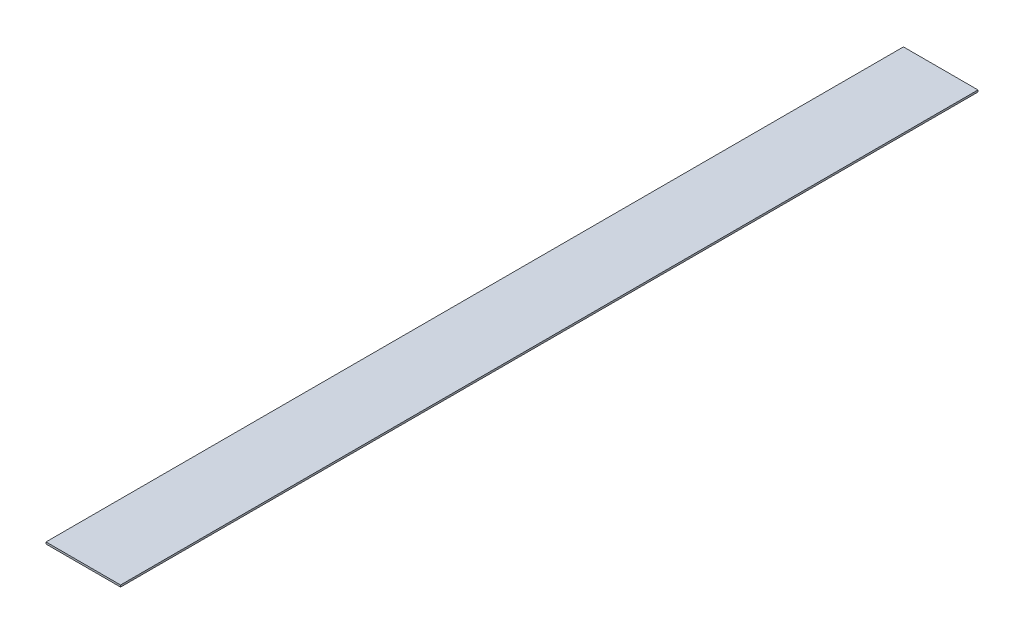
ISO-10303-21;
HEADER;
FILE_DESCRIPTION(('STEP AP214'),'2;1');
FILE_NAME('part.step','',(''),(''),'','','');
FILE_SCHEMA(('AUTOMOTIVE_DESIGN { 1 0 10303 214 1 1 1 1 }'));
ENDSEC;
DATA;
#1=APPLICATION_CONTEXT('core data for automotive mechanical design processes');
#2=APPLICATION_PROTOCOL_DEFINITION('international standard','automotive_design',2000,#1);
#3=PRODUCT_CONTEXT('',#1,'mechanical');
#4=PRODUCT('Part','Part','',(#3));
#5=PRODUCT_RELATED_PRODUCT_CATEGORY('part','',(#4));
#6=PRODUCT_DEFINITION_FORMATION('','',#4);
#7=PRODUCT_DEFINITION_CONTEXT('part definition',#1,'design');
#8=PRODUCT_DEFINITION('design','',#6,#7);
#9=PRODUCT_DEFINITION_SHAPE('','',#8);
#10=(LENGTH_UNIT() NAMED_UNIT(*) SI_UNIT(.MILLI.,.METRE.));
#11=(NAMED_UNIT(*) PLANE_ANGLE_UNIT() SI_UNIT($,.RADIAN.));
#12=(NAMED_UNIT(*) SI_UNIT($,.STERADIAN.) SOLID_ANGLE_UNIT());
#13=UNCERTAINTY_MEASURE_WITH_UNIT(LENGTH_MEASURE(1.E-05),#10,'distance_accuracy_value','');
#14=(GEOMETRIC_REPRESENTATION_CONTEXT(3) GLOBAL_UNCERTAINTY_ASSIGNED_CONTEXT((#13)) GLOBAL_UNIT_ASSIGNED_CONTEXT((#10,
#11,#12)) REPRESENTATION_CONTEXT('',''));
#15=CARTESIAN_POINT('',(0.,0.,0.));
#16=DIRECTION('',(0.,0.,1.));
#17=DIRECTION('',(1.,0.,0.));
#18=AXIS2_PLACEMENT_3D('',#15,#16,#17);
#19=CARTESIAN_POINT('',(100.,2.5,1150.));
#20=DIRECTION('',(-1.,0.,0.));
#21=DIRECTION('',(0.,0.,1.));
#22=AXIS2_PLACEMENT_3D('',#19,#20,#21);
#23=PLANE('',#22);
#24=DIRECTION('',(0.,1.,0.));
#25=VECTOR('',#24,1.);
#26=CARTESIAN_POINT('',(100.,2.5,-1150.));
#27=LINE('',#26,#25);
#28=CARTESIAN_POINT('',(100.,-2.5,-1150.));
#29=VERTEX_POINT('',#28);
#30=CARTESIAN_POINT('',(100.,2.5,-1150.));
#31=VERTEX_POINT('',#30);
#32=EDGE_CURVE('E95',#29,#31,#27,.T.);
#33=ORIENTED_EDGE('',*,*,#32,.T.);
#34=DIRECTION('',(0.,0.,-1.));
#35=VECTOR('',#34,1.);
#36=CARTESIAN_POINT('',(100.,2.5,1150.));
#37=LINE('',#36,#35);
#38=CARTESIAN_POINT('',(100.,2.5,1150.));
#39=VERTEX_POINT('',#38);
#40=EDGE_CURVE('E11',#39,#31,#37,.T.);
#41=ORIENTED_EDGE('',*,*,#40,.F.);
#42=DIRECTION('',(0.,1.,0.));
#43=VECTOR('',#42,1.);
#44=CARTESIAN_POINT('',(100.,2.5,1150.));
#45=LINE('',#44,#43);
#46=CARTESIAN_POINT('',(100.,-2.5,1150.));
#47=VERTEX_POINT('',#46);
#48=EDGE_CURVE('E83',#47,#39,#45,.T.);
#49=ORIENTED_EDGE('',*,*,#48,.F.);
#50=DIRECTION('',(0.,0.,-1.));
#51=VECTOR('',#50,1.);
#52=CARTESIAN_POINT('',(100.,-2.5,1150.));
#53=LINE('',#52,#51);
#54=EDGE_CURVE('E91',#47,#29,#53,.T.);
#55=ORIENTED_EDGE('',*,*,#54,.T.);
#56=EDGE_LOOP('',(#33,#41,#49,#55));
#57=FACE_BOUND('',#56,.T.);
#58=ADVANCED_FACE('F32',(#57),#23,.F.);
#59=CARTESIAN_POINT('',(-100.,2.5,1150.));
#60=DIRECTION('',(0.,-1.,0.));
#61=DIRECTION('',(0.,0.,-1.));
#62=AXIS2_PLACEMENT_3D('',#59,#60,#61);
#63=PLANE('',#62);
#64=DIRECTION('',(-1.,0.,0.));
#65=VECTOR('',#64,1.);
#66=CARTESIAN_POINT('',(-100.,2.5,-1150.));
#67=LINE('',#66,#65);
#68=CARTESIAN_POINT('',(-100.,2.5,-1150.));
#69=VERTEX_POINT('',#68);
#70=EDGE_CURVE('E87',#31,#69,#67,.T.);
#71=ORIENTED_EDGE('',*,*,#70,.T.);
#72=DIRECTION('',(0.,0.,-1.));
#73=VECTOR('',#72,1.);
#74=CARTESIAN_POINT('',(-100.,2.5,1150.));
#75=LINE('',#74,#73);
#76=CARTESIAN_POINT('',(-100.,2.5,1150.));
#77=VERTEX_POINT('',#76);
#78=EDGE_CURVE('E40',#77,#69,#75,.T.);
#79=ORIENTED_EDGE('',*,*,#78,.F.);
#80=DIRECTION('',(-1.,0.,0.));
#81=VECTOR('',#80,1.);
#82=CARTESIAN_POINT('',(-100.,2.5,1150.));
#83=LINE('',#82,#81);
#84=EDGE_CURVE('E78',#39,#77,#83,.T.);
#85=ORIENTED_EDGE('',*,*,#84,.F.);
#86=ORIENTED_EDGE('',*,*,#40,.T.);
#87=EDGE_LOOP('',(#71,#79,#85,#86));
#88=FACE_BOUND('',#87,.T.);
#89=ADVANCED_FACE('F86',(#88),#63,.F.);
#90=CARTESIAN_POINT('',(-100.,2.5,1150.));
#91=DIRECTION('',(1.,0.,0.));
#92=DIRECTION('',(0.,0.,-1.));
#93=AXIS2_PLACEMENT_3D('',#90,#91,#92);
#94=PLANE('',#93);
#95=DIRECTION('',(0.,-1.,0.));
#96=VECTOR('',#95,1.);
#97=CARTESIAN_POINT('',(-100.,2.5,-1150.));
#98=LINE('',#97,#96);
#99=CARTESIAN_POINT('',(-100.,-2.5,-1150.));
#100=VERTEX_POINT('',#99);
#101=EDGE_CURVE('E65',#69,#100,#98,.T.);
#102=ORIENTED_EDGE('',*,*,#101,.T.);
#103=DIRECTION('',(0.,0.,-1.));
#104=VECTOR('',#103,1.);
#105=CARTESIAN_POINT('',(-100.,-2.5,1150.));
#106=LINE('',#105,#104);
#107=CARTESIAN_POINT('',(-100.,-2.5,1150.));
#108=VERTEX_POINT('',#107);
#109=EDGE_CURVE('E88',#108,#100,#106,.T.);
#110=ORIENTED_EDGE('',*,*,#109,.F.);
#111=DIRECTION('',(0.,-1.,0.));
#112=VECTOR('',#111,1.);
#113=CARTESIAN_POINT('',(-100.,2.5,1150.));
#114=LINE('',#113,#112);
#115=EDGE_CURVE('E81',#77,#108,#114,.T.);
#116=ORIENTED_EDGE('',*,*,#115,.F.);
#117=ORIENTED_EDGE('',*,*,#78,.T.);
#118=EDGE_LOOP('',(#102,#110,#116,#117));
#119=FACE_BOUND('',#118,.T.);
#120=ADVANCED_FACE('F89',(#119),#94,.F.);
#121=CARTESIAN_POINT('',(-100.,-2.5,1150.));
#122=DIRECTION('',(0.,1.,0.));
#123=DIRECTION('',(0.,0.,1.));
#124=AXIS2_PLACEMENT_3D('',#121,#122,#123);
#125=PLANE('',#124);
#126=DIRECTION('',(1.,0.,0.));
#127=VECTOR('',#126,1.);
#128=CARTESIAN_POINT('',(-100.,-2.5,-1150.));
#129=LINE('',#128,#127);
#130=EDGE_CURVE('E71',#100,#29,#129,.T.);
#131=ORIENTED_EDGE('',*,*,#130,.T.);
#132=ORIENTED_EDGE('',*,*,#54,.F.);
#133=DIRECTION('',(1.,0.,0.));
#134=VECTOR('',#133,1.);
#135=CARTESIAN_POINT('',(-100.,-2.5,1150.));
#136=LINE('',#135,#134);
#137=EDGE_CURVE('E48',#108,#47,#136,.T.);
#138=ORIENTED_EDGE('',*,*,#137,.F.);
#139=ORIENTED_EDGE('',*,*,#109,.T.);
#140=EDGE_LOOP('',(#131,#132,#138,#139));
#141=FACE_BOUND('',#140,.T.);
#142=ADVANCED_FACE('F102',(#141),#125,.F.);
#143=CARTESIAN_POINT('',(0.,0.,1150.));
#144=DIRECTION('',(0.,0.,1.));
#145=DIRECTION('',(1.,0.,0.));
#146=AXIS2_PLACEMENT_3D('',#143,#144,#145);
#147=PLANE('',#146);
#148=ORIENTED_EDGE('',*,*,#48,.T.);
#149=ORIENTED_EDGE('',*,*,#84,.T.);
#150=ORIENTED_EDGE('',*,*,#115,.T.);
#151=ORIENTED_EDGE('',*,*,#137,.T.);
#152=EDGE_LOOP('',(#148,#149,#150,#151));
#153=FACE_BOUND('',#152,.T.);
#154=ADVANCED_FACE('F79',(#153),#147,.T.);
#155=CARTESIAN_POINT('',(0.,0.,-1150.));
#156=DIRECTION('',(0.,0.,1.));
#157=DIRECTION('',(1.,0.,0.));
#158=AXIS2_PLACEMENT_3D('',#155,#156,#157);
#159=PLANE('',#158);
#160=ORIENTED_EDGE('',*,*,#32,.F.);
#161=ORIENTED_EDGE('',*,*,#130,.F.);
#162=ORIENTED_EDGE('',*,*,#101,.F.);
#163=ORIENTED_EDGE('',*,*,#70,.F.);
#164=EDGE_LOOP('',(#160,#161,#162,#163));
#165=FACE_BOUND('',#164,.T.);
#166=ADVANCED_FACE('F105',(#165),#159,.F.);
#167=CLOSED_SHELL('',(#58,#89,#120,#142,#154,#166));
#168=MANIFOLD_SOLID_BREP('B2',#167);
#169=ADVANCED_BREP_SHAPE_REPRESENTATION('',(#18,#168),#14);
#170=SHAPE_DEFINITION_REPRESENTATION(#9,#169);
ENDSEC;
END-ISO-10303-21;
